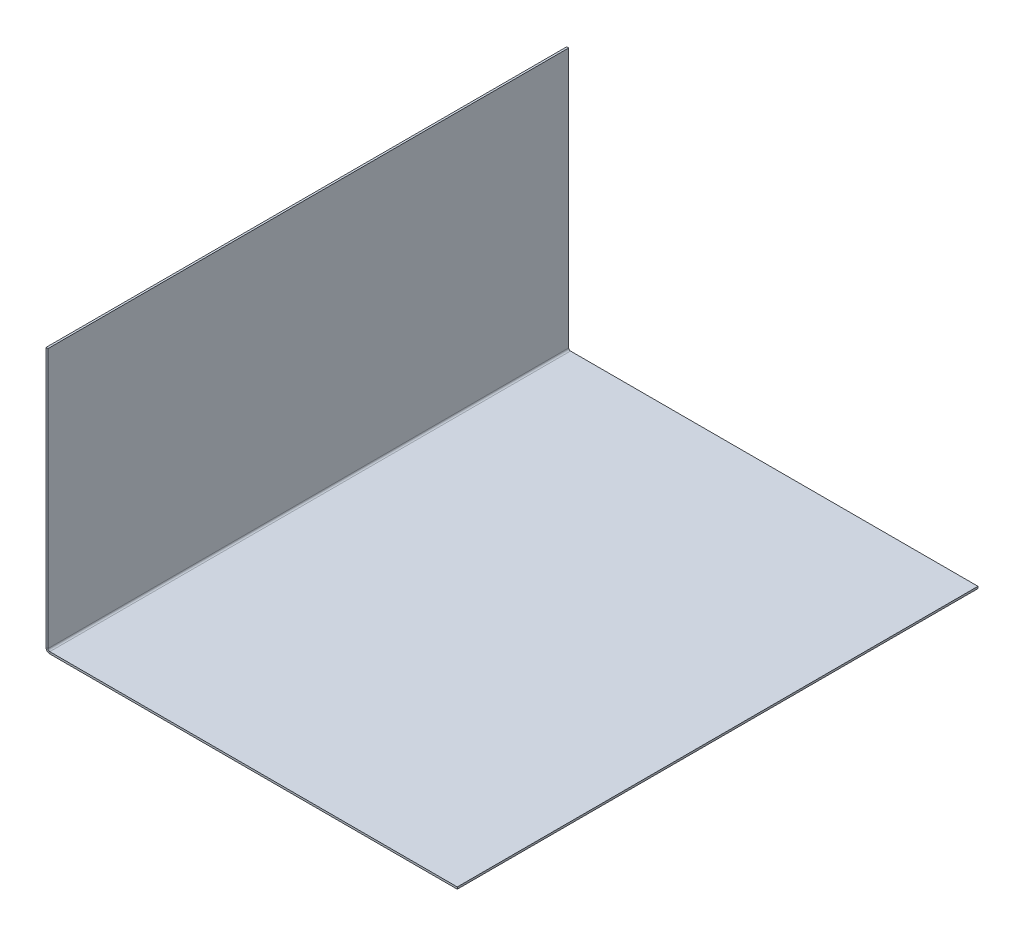
ISO-10303-21;
HEADER;
FILE_DESCRIPTION(('STEP AP214'),'2;1');
FILE_NAME('part.step','',(''),(''),'','','');
FILE_SCHEMA(('AUTOMOTIVE_DESIGN { 1 0 10303 214 1 1 1 1 }'));
ENDSEC;
DATA;
#1=APPLICATION_CONTEXT('core data for automotive mechanical design processes');
#2=APPLICATION_PROTOCOL_DEFINITION('international standard','automotive_design',2000,#1);
#3=PRODUCT_CONTEXT('',#1,'mechanical');
#4=PRODUCT('Part','Part','',(#3));
#5=PRODUCT_RELATED_PRODUCT_CATEGORY('part','',(#4));
#6=PRODUCT_DEFINITION_FORMATION('','',#4);
#7=PRODUCT_DEFINITION_CONTEXT('part definition',#1,'design');
#8=PRODUCT_DEFINITION('design','',#6,#7);
#9=PRODUCT_DEFINITION_SHAPE('','',#8);
#10=(LENGTH_UNIT() NAMED_UNIT(*) SI_UNIT(.MILLI.,.METRE.));
#11=(NAMED_UNIT(*) PLANE_ANGLE_UNIT() SI_UNIT($,.RADIAN.));
#12=(NAMED_UNIT(*) SI_UNIT($,.STERADIAN.) SOLID_ANGLE_UNIT());
#13=UNCERTAINTY_MEASURE_WITH_UNIT(LENGTH_MEASURE(1.E-05),#10,'distance_accuracy_value','');
#14=(GEOMETRIC_REPRESENTATION_CONTEXT(3) GLOBAL_UNCERTAINTY_ASSIGNED_CONTEXT((#13)) GLOBAL_UNIT_ASSIGNED_CONTEXT((#10,
#11,#12)) REPRESENTATION_CONTEXT('',''));
#15=CARTESIAN_POINT('',(0.,0.,0.));
#16=DIRECTION('',(0.,0.,1.));
#17=DIRECTION('',(1.,0.,0.));
#18=AXIS2_PLACEMENT_3D('',#15,#16,#17);
#19=CARTESIAN_POINT('',(702.141387362612,244.055900000004,0.));
#20=DIRECTION('',(0.,1.,0.));
#21=DIRECTION('',(-1.,0.,0.));
#22=AXIS2_PLACEMENT_3D('',#19,#20,#21);
#23=PLANE('',#22);
#24=DIRECTION('',(0.,0.,-1.));
#25=VECTOR('',#24,1.);
#26=CARTESIAN_POINT('',(-383.698700906573,244.0559,0.));
#27=LINE('',#26,#25);
#28=CARTESIAN_POINT('',(-383.698700906573,244.0559,485.806747279479));
#29=VERTEX_POINT('',#28);
#30=CARTESIAN_POINT('',(-383.698700906573,244.0559,0.));
#31=VERTEX_POINT('',#30);
#32=EDGE_CURVE('E87',#29,#31,#27,.T.);
#33=ORIENTED_EDGE('',*,*,#32,.F.);
#34=DIRECTION('',(-1.,0.,0.));
#35=VECTOR('',#34,1.);
#36=CARTESIAN_POINT('',(702.141387362612,244.055900000004,485.806747279479));
#37=LINE('',#36,#35);
#38=CARTESIAN_POINT('',(-381.844500906573,244.0559,485.806747279479));
#39=VERTEX_POINT('',#38);
#40=EDGE_CURVE('E11',#39,#29,#37,.T.);
#41=ORIENTED_EDGE('',*,*,#40,.F.);
#42=DIRECTION('',(0.,0.,-1.));
#43=VECTOR('',#42,1.);
#44=CARTESIAN_POINT('',(-381.844500906573,244.0559,0.));
#45=LINE('',#44,#43);
#46=CARTESIAN_POINT('',(-381.844500906573,244.0559,0.));
#47=VERTEX_POINT('',#46);
#48=EDGE_CURVE('E64',#39,#47,#45,.T.);
#49=ORIENTED_EDGE('',*,*,#48,.T.);
#50=DIRECTION('',(-1.,0.,0.));
#51=VECTOR('',#50,1.);
#52=CARTESIAN_POINT('',(702.141387362612,244.055900000004,0.));
#53=LINE('',#52,#51);
#54=EDGE_CURVE('E83',#47,#31,#53,.T.);
#55=ORIENTED_EDGE('',*,*,#54,.T.);
#56=EDGE_LOOP('',(#33,#41,#49,#55));
#57=FACE_BOUND('',#56,.T.);
#58=ADVANCED_FACE('F44',(#57),#23,.T.);
#59=CARTESIAN_POINT('',(702.141387362613,3.71924713249427E-12,0.));
#60=DIRECTION('',(0.,0.,-1.));
#61=DIRECTION('',(0.,1.,0.));
#62=AXIS2_PLACEMENT_3D('',#59,#60,#61);
#63=PLANE('',#62);
#64=DIRECTION('',(0.,-1.,0.));
#65=VECTOR('',#64,1.);
#66=CARTESIAN_POINT('',(-383.698700906572,-1.27675647831893E-12,0.));
#67=LINE('',#66,#65);
#68=CARTESIAN_POINT('',(-383.698700906572,1.66369999999997,0.));
#69=VERTEX_POINT('',#68);
#70=EDGE_CURVE('E121',#31,#69,#67,.T.);
#71=ORIENTED_EDGE('',*,*,#70,.F.);
#72=ORIENTED_EDGE('',*,*,#54,.F.);
#73=DIRECTION('',(0.,-1.,0.));
#74=VECTOR('',#73,1.);
#75=CARTESIAN_POINT('',(-381.844500906572,0.,0.));
#76=LINE('',#75,#74);
#77=CARTESIAN_POINT('',(-381.844500906572,1.66369999999999,0.));
#78=VERTEX_POINT('',#77);
#79=EDGE_CURVE('E135',#47,#78,#76,.T.);
#80=ORIENTED_EDGE('',*,*,#79,.T.);
#81=DIRECTION('',(-1.,0.,0.));
#82=VECTOR('',#81,1.);
#83=CARTESIAN_POINT('',(702.141387362613,1.66370000000371,0.));
#84=LINE('',#83,#82);
#85=EDGE_CURVE('E133',#78,#69,#84,.T.);
#86=ORIENTED_EDGE('',*,*,#85,.T.);
#87=EDGE_LOOP('',(#71,#72,#80,#86));
#88=FACE_BOUND('',#87,.T.);
#89=ADVANCED_FACE('F134',(#88),#63,.T.);
#90=CARTESIAN_POINT('',(-383.698700906572,-1.27675647831893E-12,0.));
#91=DIRECTION('',(1.,0.,0.));
#92=DIRECTION('',(0.,1.,0.));
#93=AXIS2_PLACEMENT_3D('',#90,#91,#92);
#94=PLANE('',#93);
#95=DIRECTION('',(0.,0.,-1.));
#96=VECTOR('',#95,1.);
#97=CARTESIAN_POINT('',(-383.698700906572,1.66369999999999,0.));
#98=LINE('',#97,#96);
#99=CARTESIAN_POINT('',(-383.698700906572,1.66369999999999,485.806747279479));
#100=VERTEX_POINT('',#99);
#101=EDGE_CURVE('E126',#100,#69,#98,.T.);
#102=ORIENTED_EDGE('',*,*,#101,.F.);
#103=DIRECTION('',(0.,1.,0.));
#104=VECTOR('',#103,1.);
#105=CARTESIAN_POINT('',(-383.698700906572,-1.27675647831893E-12,485.806747279479));
#106=LINE('',#105,#104);
#107=EDGE_CURVE('E141',#100,#29,#106,.T.);
#108=ORIENTED_EDGE('',*,*,#107,.T.);
#109=ORIENTED_EDGE('',*,*,#32,.T.);
#110=ORIENTED_EDGE('',*,*,#70,.T.);
#111=EDGE_LOOP('',(#102,#108,#109,#110));
#112=FACE_BOUND('',#111,.T.);
#113=ADVANCED_FACE('F123',(#112),#94,.F.);
#114=CARTESIAN_POINT('',(702.141387362612,244.055900000004,485.806747279479));
#115=DIRECTION('',(0.,0.,1.));
#116=DIRECTION('',(0.,-1.,0.));
#117=AXIS2_PLACEMENT_3D('',#114,#115,#116);
#118=PLANE('',#117);
#119=ORIENTED_EDGE('',*,*,#107,.F.);
#120=DIRECTION('',(-1.,0.,0.));
#121=VECTOR('',#120,1.);
#122=CARTESIAN_POINT('',(702.141387362613,1.66370000000371,485.806747279479));
#123=LINE('',#122,#121);
#124=CARTESIAN_POINT('',(-381.844500906572,1.66369999999999,485.806747279479));
#125=VERTEX_POINT('',#124);
#126=EDGE_CURVE('E152',#125,#100,#123,.T.);
#127=ORIENTED_EDGE('',*,*,#126,.F.);
#128=DIRECTION('',(0.,1.,0.));
#129=VECTOR('',#128,1.);
#130=CARTESIAN_POINT('',(-381.844500906573,244.0559,485.806747279479));
#131=LINE('',#130,#129);
#132=EDGE_CURVE('E55',#125,#39,#131,.T.);
#133=ORIENTED_EDGE('',*,*,#132,.T.);
#134=ORIENTED_EDGE('',*,*,#40,.T.);
#135=EDGE_LOOP('',(#119,#127,#133,#134));
#136=FACE_BOUND('',#135,.T.);
#137=ADVANCED_FACE('F261',(#136),#118,.T.);
#138=CARTESIAN_POINT('',(-381.844500906572,-1.27675647831893E-12,0.));
#139=DIRECTION('',(1.,0.,0.));
#140=DIRECTION('',(0.,1.,0.));
#141=AXIS2_PLACEMENT_3D('',#138,#139,#140);
#142=PLANE('',#141);
#143=ORIENTED_EDGE('',*,*,#132,.F.);
#144=DIRECTION('',(0.,0.,1.));
#145=VECTOR('',#144,1.);
#146=CARTESIAN_POINT('',(-381.844500906572,1.66369999999999,0.));
#147=LINE('',#146,#145);
#148=EDGE_CURVE('E48',#78,#125,#147,.T.);
#149=ORIENTED_EDGE('',*,*,#148,.F.);
#150=ORIENTED_EDGE('',*,*,#79,.F.);
#151=ORIENTED_EDGE('',*,*,#48,.F.);
#152=EDGE_LOOP('',(#143,#149,#150,#151));
#153=FACE_BOUND('',#152,.T.);
#154=ADVANCED_FACE('F46',(#153),#142,.T.);
#155=CARTESIAN_POINT('',(0.,1231.91342330713,485.806747279479));
#156=DIRECTION('',(0.,0.,-1.));
#157=DIRECTION('',(-1.,0.,0.));
#158=AXIS2_PLACEMENT_3D('',#155,#156,#157);
#159=PLANE('',#158);
#160=DIRECTION('',(1.,0.,0.));
#161=VECTOR('',#160,1.);
#162=CARTESIAN_POINT('',(0.,-1.8542,485.806747279479));
#163=LINE('',#162,#161);
#164=CARTESIAN_POINT('',(-380.180800906572,-1.85419999999992,485.806747279479));
#165=VERTEX_POINT('',#164);
#166=CARTESIAN_POINT('',(0.,-1.85419999999992,485.806747279479));
#167=VERTEX_POINT('',#166);
#168=EDGE_CURVE('E98',#165,#167,#163,.T.);
#169=ORIENTED_EDGE('',*,*,#168,.T.);
#170=DIRECTION('',(0.,-1.,0.));
#171=VECTOR('',#170,1.);
#172=CARTESIAN_POINT('',(0.,1231.91342330713,485.806747279479));
#173=LINE('',#172,#171);
#174=CARTESIAN_POINT('',(0.,0.,485.806747279479));
#175=VERTEX_POINT('',#174);
#176=EDGE_CURVE('E202',#175,#167,#173,.T.);
#177=ORIENTED_EDGE('',*,*,#176,.F.);
#178=DIRECTION('',(1.,0.,0.));
#179=VECTOR('',#178,1.);
#180=CARTESIAN_POINT('',(0.,0.,485.806747279479));
#181=LINE('',#180,#179);
#182=CARTESIAN_POINT('',(-380.180800906572,0.,485.806747279479));
#183=VERTEX_POINT('',#182);
#184=EDGE_CURVE('E188',#183,#175,#181,.T.);
#185=ORIENTED_EDGE('',*,*,#184,.F.);
#186=DIRECTION('',(0.,-1.,0.));
#187=VECTOR('',#186,1.);
#188=CARTESIAN_POINT('',(-380.180800906572,1231.91342330713,485.806747279479));
#189=LINE('',#188,#187);
#190=EDGE_CURVE('E94',#183,#165,#189,.T.);
#191=ORIENTED_EDGE('',*,*,#190,.T.);
#192=EDGE_LOOP('',(#169,#177,#185,#191));
#193=FACE_BOUND('',#192,.T.);
#194=ADVANCED_FACE('F238',(#193),#159,.F.);
#195=CARTESIAN_POINT('',(0.,1231.91342330713,0.));
#196=DIRECTION('',(-1.,0.,0.));
#197=DIRECTION('',(0.,0.,1.));
#198=AXIS2_PLACEMENT_3D('',#195,#196,#197);
#199=PLANE('',#198);
#200=DIRECTION('',(0.,0.,-1.));
#201=VECTOR('',#200,1.);
#202=CARTESIAN_POINT('',(0.,-1.8542,0.));
#203=LINE('',#202,#201);
#204=CARTESIAN_POINT('',(0.,-1.8542,0.));
#205=VERTEX_POINT('',#204);
#206=EDGE_CURVE('E180',#167,#205,#203,.T.);
#207=ORIENTED_EDGE('',*,*,#206,.T.);
#208=DIRECTION('',(0.,-1.,0.));
#209=VECTOR('',#208,1.);
#210=CARTESIAN_POINT('',(0.,1231.91342330713,0.));
#211=LINE('',#210,#209);
#212=CARTESIAN_POINT('',(0.,0.,0.));
#213=VERTEX_POINT('',#212);
#214=EDGE_CURVE('E199',#213,#205,#211,.T.);
#215=ORIENTED_EDGE('',*,*,#214,.F.);
#216=DIRECTION('',(0.,0.,-1.));
#217=VECTOR('',#216,1.);
#218=CARTESIAN_POINT('',(0.,0.,0.));
#219=LINE('',#218,#217);
#220=EDGE_CURVE('E191',#175,#213,#219,.T.);
#221=ORIENTED_EDGE('',*,*,#220,.F.);
#222=ORIENTED_EDGE('',*,*,#176,.T.);
#223=EDGE_LOOP('',(#207,#215,#221,#222));
#224=FACE_BOUND('',#223,.T.);
#225=ADVANCED_FACE('F236',(#224),#199,.F.);
#226=CARTESIAN_POINT('',(0.,1231.91342330713,0.));
#227=DIRECTION('',(0.,0.,1.));
#228=DIRECTION('',(1.,0.,0.));
#229=AXIS2_PLACEMENT_3D('',#226,#227,#228);
#230=PLANE('',#229);
#231=DIRECTION('',(-1.,0.,0.));
#232=VECTOR('',#231,1.);
#233=CARTESIAN_POINT('',(0.,-1.8542,0.));
#234=LINE('',#233,#232);
#235=CARTESIAN_POINT('',(-380.180800906572,-1.85419999999992,0.));
#236=VERTEX_POINT('',#235);
#237=EDGE_CURVE('E177',#205,#236,#234,.T.);
#238=ORIENTED_EDGE('',*,*,#237,.T.);
#239=DIRECTION('',(0.,-1.,0.));
#240=VECTOR('',#239,1.);
#241=CARTESIAN_POINT('',(-380.180800906572,1231.91342330713,0.));
#242=LINE('',#241,#240);
#243=CARTESIAN_POINT('',(-380.180800906572,0.,0.));
#244=VERTEX_POINT('',#243);
#245=EDGE_CURVE('E157',#244,#236,#242,.T.);
#246=ORIENTED_EDGE('',*,*,#245,.F.);
#247=DIRECTION('',(-1.,0.,0.));
#248=VECTOR('',#247,1.);
#249=CARTESIAN_POINT('',(0.,0.,0.));
#250=LINE('',#249,#248);
#251=EDGE_CURVE('E194',#213,#244,#250,.T.);
#252=ORIENTED_EDGE('',*,*,#251,.F.);
#253=ORIENTED_EDGE('',*,*,#214,.T.);
#254=EDGE_LOOP('',(#238,#246,#252,#253));
#255=FACE_BOUND('',#254,.T.);
#256=ADVANCED_FACE('F243',(#255),#230,.F.);
#257=CARTESIAN_POINT('',(0.,0.,0.));
#258=DIRECTION('',(0.,-1.,0.));
#259=DIRECTION('',(0.,0.,-1.));
#260=AXIS2_PLACEMENT_3D('',#257,#258,#259);
#261=PLANE('',#260);
#262=DIRECTION('',(0.,0.,-1.));
#263=VECTOR('',#262,1.);
#264=CARTESIAN_POINT('',(-380.180800906572,0.,485.806747279479));
#265=LINE('',#264,#263);
#266=EDGE_CURVE('E184',#183,#244,#265,.T.);
#267=ORIENTED_EDGE('',*,*,#266,.F.);
#268=ORIENTED_EDGE('',*,*,#184,.T.);
#269=ORIENTED_EDGE('',*,*,#220,.T.);
#270=ORIENTED_EDGE('',*,*,#251,.T.);
#271=EDGE_LOOP('',(#267,#268,#269,#270));
#272=FACE_BOUND('',#271,.T.);
#273=ADVANCED_FACE('F240',(#272),#261,.F.);
#274=CARTESIAN_POINT('',(0.,-1.8542,0.));
#275=DIRECTION('',(0.,-1.,0.));
#276=DIRECTION('',(0.,0.,-1.));
#277=AXIS2_PLACEMENT_3D('',#274,#275,#276);
#278=PLANE('',#277);
#279=ORIENTED_EDGE('',*,*,#168,.F.);
#280=DIRECTION('',(0.,0.,-1.));
#281=VECTOR('',#280,1.);
#282=CARTESIAN_POINT('',(-380.180800906572,-1.85419999999999,485.806747279479));
#283=LINE('',#282,#281);
#284=EDGE_CURVE('E173',#165,#236,#283,.T.);
#285=ORIENTED_EDGE('',*,*,#284,.T.);
#286=ORIENTED_EDGE('',*,*,#237,.F.);
#287=ORIENTED_EDGE('',*,*,#206,.F.);
#288=EDGE_LOOP('',(#279,#285,#286,#287));
#289=FACE_BOUND('',#288,.T.);
#290=ADVANCED_FACE('F232',(#289),#278,.T.);
#291=CARTESIAN_POINT('',(-380.180800906572,1.66369999999999,0.));
#292=DIRECTION('',(0.,0.,-1.));
#293=DIRECTION('',(-1.,0.,0.));
#294=AXIS2_PLACEMENT_3D('',#291,#292,#293);
#295=PLANE('',#294);
#296=ORIENTED_EDGE('',*,*,#85,.F.);
#297=CARTESIAN_POINT('',(-380.180800906572,1.66369999999999,0.));
#298=DIRECTION('',(0.,0.,1.));
#299=DIRECTION('',(1.,0.,0.));
#300=AXIS2_PLACEMENT_3D('',#297,#298,#299);
#301=CIRCLE('',#300,1.66369999999999);
#302=EDGE_CURVE('E166',#78,#244,#301,.T.);
#303=ORIENTED_EDGE('',*,*,#302,.T.);
#304=ORIENTED_EDGE('',*,*,#245,.T.);
#305=CARTESIAN_POINT('',(-380.180800906572,1.66369999999999,0.));
#306=DIRECTION('',(0.,0.,1.));
#307=DIRECTION('',(1.,0.,0.));
#308=AXIS2_PLACEMENT_3D('',#305,#306,#307);
#309=CIRCLE('',#308,3.51789999999999);
#310=EDGE_CURVE('E148',#69,#236,#309,.T.);
#311=ORIENTED_EDGE('',*,*,#310,.F.);
#312=EDGE_LOOP('',(#296,#303,#304,#311));
#313=FACE_BOUND('',#312,.T.);
#314=ADVANCED_FACE('F155',(#313),#295,.T.);
#315=CARTESIAN_POINT('',(-380.180800906572,1.66369999999999,485.806747279479));
#316=DIRECTION('',(0.,0.,1.));
#317=DIRECTION('',(1.,0.,0.));
#318=AXIS2_PLACEMENT_3D('',#315,#316,#317);
#319=PLANE('',#318);
#320=CARTESIAN_POINT('',(-380.180800906572,1.66369999999999,485.806747279479));
#321=DIRECTION('',(0.,0.,1.));
#322=DIRECTION('',(1.,0.,0.));
#323=AXIS2_PLACEMENT_3D('',#320,#321,#322);
#324=CIRCLE('',#323,1.66369999999999);
#325=EDGE_CURVE('E159',#183,#125,#324,.F.);
#326=ORIENTED_EDGE('',*,*,#325,.T.);
#327=ORIENTED_EDGE('',*,*,#126,.T.);
#328=CARTESIAN_POINT('',(-380.180800906572,1.66369999999999,485.806747279479));
#329=DIRECTION('',(0.,0.,1.));
#330=DIRECTION('',(1.,0.,0.));
#331=AXIS2_PLACEMENT_3D('',#328,#329,#330);
#332=CIRCLE('',#331,3.51789999999999);
#333=EDGE_CURVE('E150',#165,#100,#332,.F.);
#334=ORIENTED_EDGE('',*,*,#333,.F.);
#335=ORIENTED_EDGE('',*,*,#190,.F.);
#336=EDGE_LOOP('',(#326,#327,#334,#335));
#337=FACE_BOUND('',#336,.T.);
#338=ADVANCED_FACE('F229',(#337),#319,.T.);
#339=CARTESIAN_POINT('',(-380.180800906572,1.66369999999999,-792.671220406478));
#340=DIRECTION('',(0.,0.,1.));
#341=DIRECTION('',(1.,0.,0.));
#342=AXIS2_PLACEMENT_3D('',#339,#340,#341);
#343=CYLINDRICAL_SURFACE('',#342,3.51789999999999);
#344=ORIENTED_EDGE('',*,*,#284,.F.);
#345=ORIENTED_EDGE('',*,*,#333,.T.);
#346=ORIENTED_EDGE('',*,*,#101,.T.);
#347=ORIENTED_EDGE('',*,*,#310,.T.);
#348=EDGE_LOOP('',(#344,#345,#346,#347));
#349=FACE_BOUND('',#348,.T.);
#350=ADVANCED_FACE('F147',(#349),#343,.T.);
#351=CARTESIAN_POINT('',(-380.180800906572,1.66369999999999,-792.671220406478));
#352=DIRECTION('',(0.,0.,1.));
#353=DIRECTION('',(1.,0.,0.));
#354=AXIS2_PLACEMENT_3D('',#351,#352,#353);
#355=CYLINDRICAL_SURFACE('',#354,1.66369999999999);
#356=ORIENTED_EDGE('',*,*,#266,.T.);
#357=ORIENTED_EDGE('',*,*,#302,.F.);
#358=ORIENTED_EDGE('',*,*,#148,.T.);
#359=ORIENTED_EDGE('',*,*,#325,.F.);
#360=EDGE_LOOP('',(#356,#357,#358,#359));
#361=FACE_BOUND('',#360,.T.);
#362=ADVANCED_FACE('F228',(#361),#355,.F.);
#363=CLOSED_SHELL('',(#58,#89,#113,#137,#154,#194,#225,#256,#273,#290,#314,#338,#350,#362));
#364=MANIFOLD_SOLID_BREP('B2',#363);
#365=ADVANCED_BREP_SHAPE_REPRESENTATION('',(#18,#364),#14);
#366=SHAPE_DEFINITION_REPRESENTATION(#9,#365);
ENDSEC;
END-ISO-10303-21;
